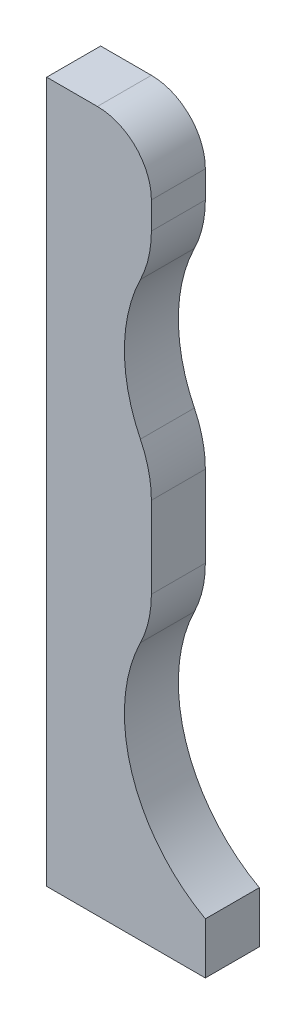
ISO-10303-21;
HEADER;
FILE_DESCRIPTION(('STEP AP214'),'2;1');
FILE_NAME('part.step','',(''),(''),'','','');
FILE_SCHEMA(('AUTOMOTIVE_DESIGN { 1 0 10303 214 1 1 1 1 }'));
ENDSEC;
DATA;
#1=APPLICATION_CONTEXT('core data for automotive mechanical design processes');
#2=APPLICATION_PROTOCOL_DEFINITION('international standard','automotive_design',2000,#1);
#3=PRODUCT_CONTEXT('',#1,'mechanical');
#4=PRODUCT('Part','Part','',(#3));
#5=PRODUCT_RELATED_PRODUCT_CATEGORY('part','',(#4));
#6=PRODUCT_DEFINITION_FORMATION('','',#4);
#7=PRODUCT_DEFINITION_CONTEXT('part definition',#1,'design');
#8=PRODUCT_DEFINITION('design','',#6,#7);
#9=PRODUCT_DEFINITION_SHAPE('','',#8);
#10=(LENGTH_UNIT() NAMED_UNIT(*) SI_UNIT(.MILLI.,.METRE.));
#11=(NAMED_UNIT(*) PLANE_ANGLE_UNIT() SI_UNIT($,.RADIAN.));
#12=(NAMED_UNIT(*) SI_UNIT($,.STERADIAN.) SOLID_ANGLE_UNIT());
#13=UNCERTAINTY_MEASURE_WITH_UNIT(LENGTH_MEASURE(1.E-05),#10,'distance_accuracy_value','');
#14=(GEOMETRIC_REPRESENTATION_CONTEXT(3) GLOBAL_UNCERTAINTY_ASSIGNED_CONTEXT((#13)) GLOBAL_UNIT_ASSIGNED_CONTEXT((#10,
#11,#12)) REPRESENTATION_CONTEXT('',''));
#15=CARTESIAN_POINT('',(0.,0.,0.));
#16=DIRECTION('',(0.,0.,1.));
#17=DIRECTION('',(1.,0.,0.));
#18=AXIS2_PLACEMENT_3D('',#15,#16,#17);
#19=CARTESIAN_POINT('',(3197.45362169219,2665.2958617396,3.175));
#20=DIRECTION('',(0.,0.,-1.));
#21=DIRECTION('',(-1.,0.,0.));
#22=AXIS2_PLACEMENT_3D('',#19,#20,#21);
#23=CYLINDRICAL_SURFACE('',#22,6.35000000000036);
#24=CARTESIAN_POINT('',(3197.45362169219,2665.2958617396,0.));
#25=DIRECTION('',(0.,0.,1.));
#26=DIRECTION('',(1.,0.,0.));
#27=AXIS2_PLACEMENT_3D('',#24,#25,#26);
#28=CIRCLE('',#27,6.35000000000036);
#29=CARTESIAN_POINT('',(3203.1575085461,2662.50513159179,0.));
#30=VERTEX_POINT('',#29);
#31=CARTESIAN_POINT('',(3203.80362169219,2665.29586173967,0.));
#32=VERTEX_POINT('',#31);
#33=EDGE_CURVE('E153',#30,#32,#28,.T.);
#34=ORIENTED_EDGE('',*,*,#33,.T.);
#35=DIRECTION('',(0.,0.,-1.));
#36=VECTOR('',#35,1.);
#37=CARTESIAN_POINT('',(3203.80362169219,2665.29586173967,3.175));
#38=LINE('',#37,#36);
#39=CARTESIAN_POINT('',(3203.80362169219,2665.29586173967,3.175));
#40=VERTEX_POINT('',#39);
#41=EDGE_CURVE('E11',#40,#32,#38,.T.);
#42=ORIENTED_EDGE('',*,*,#41,.F.);
#43=CARTESIAN_POINT('',(3197.45362169219,2665.2958617396,3.175));
#44=DIRECTION('',(0.,0.,1.));
#45=DIRECTION('',(1.,0.,0.));
#46=AXIS2_PLACEMENT_3D('',#43,#44,#45);
#47=CIRCLE('',#46,6.35000000000036);
#48=CARTESIAN_POINT('',(3203.1575085461,2662.50513159179,3.175));
#49=VERTEX_POINT('',#48);
#50=EDGE_CURVE('E175',#49,#40,#47,.T.);
#51=ORIENTED_EDGE('',*,*,#50,.F.);
#52=DIRECTION('',(0.,0.,-1.));
#53=VECTOR('',#52,1.);
#54=CARTESIAN_POINT('',(3203.1575085461,2662.50513159179,3.175));
#55=LINE('',#54,#53);
#56=EDGE_CURVE('E149',#49,#30,#55,.T.);
#57=ORIENTED_EDGE('',*,*,#56,.T.);
#58=EDGE_LOOP('',(#34,#42,#51,#57));
#59=FACE_BOUND('',#58,.T.);
#60=ADVANCED_FACE('F33',(#59),#23,.T.);
#61=CARTESIAN_POINT('',(3203.80362169219,2665.29586173967,3.175));
#62=DIRECTION('',(-1.,0.,0.));
#63=DIRECTION('',(0.,0.,1.));
#64=AXIS2_PLACEMENT_3D('',#61,#62,#63);
#65=PLANE('',#64);
#66=DIRECTION('',(0.,1.,0.));
#67=VECTOR('',#66,1.);
#68=CARTESIAN_POINT('',(3203.80362169219,2665.29586173967,0.));
#69=LINE('',#68,#67);
#70=CARTESIAN_POINT('',(3203.80362169221,2670.08611379305,0.));
#71=VERTEX_POINT('',#70);
#72=EDGE_CURVE('E156',#32,#71,#69,.T.);
#73=ORIENTED_EDGE('',*,*,#72,.T.);
#74=DIRECTION('',(0.,0.,-1.));
#75=VECTOR('',#74,1.);
#76=CARTESIAN_POINT('',(3203.80362169221,2670.08611379305,3.175));
#77=LINE('',#76,#75);
#78=CARTESIAN_POINT('',(3203.80362169221,2670.08611379305,3.175));
#79=VERTEX_POINT('',#78);
#80=EDGE_CURVE('E41',#79,#71,#77,.T.);
#81=ORIENTED_EDGE('',*,*,#80,.F.);
#82=DIRECTION('',(0.,1.,0.));
#83=VECTOR('',#82,1.);
#84=CARTESIAN_POINT('',(3203.80362169219,2665.29586173967,3.175));
#85=LINE('',#84,#83);
#86=EDGE_CURVE('E104',#40,#79,#85,.T.);
#87=ORIENTED_EDGE('',*,*,#86,.F.);
#88=ORIENTED_EDGE('',*,*,#41,.T.);
#89=EDGE_LOOP('',(#73,#81,#87,#88));
#90=FACE_BOUND('',#89,.T.);
#91=ADVANCED_FACE('F253',(#90),#65,.F.);
#92=CARTESIAN_POINT('',(3197.45362169219,2670.08611379305,3.175));
#93=DIRECTION('',(0.,0.,-1.));
#94=DIRECTION('',(-1.,0.,0.));
#95=AXIS2_PLACEMENT_3D('',#92,#93,#94);
#96=CYLINDRICAL_SURFACE('',#95,6.35000000001626);
#97=CARTESIAN_POINT('',(3197.45362169219,2670.08611379305,0.));
#98=DIRECTION('',(0.,0.,1.));
#99=DIRECTION('',(1.,0.,0.));
#100=AXIS2_PLACEMENT_3D('',#97,#98,#99);
#101=CIRCLE('',#100,6.35000000001626);
#102=CARTESIAN_POINT('',(3203.1575085461,2672.87684394092,0.));
#103=VERTEX_POINT('',#102);
#104=EDGE_CURVE('E158',#71,#103,#101,.T.);
#105=ORIENTED_EDGE('',*,*,#104,.T.);
#106=DIRECTION('',(0.,0.,-1.));
#107=VECTOR('',#106,1.);
#108=CARTESIAN_POINT('',(3203.1575085461,2672.87684394092,3.175));
#109=LINE('',#108,#107);
#110=CARTESIAN_POINT('',(3203.1575085461,2672.87684394092,3.175));
#111=VERTEX_POINT('',#110);
#112=EDGE_CURVE('E194',#111,#103,#109,.T.);
#113=ORIENTED_EDGE('',*,*,#112,.F.);
#114=CARTESIAN_POINT('',(3197.45362169219,2670.08611379305,3.175));
#115=DIRECTION('',(0.,0.,1.));
#116=DIRECTION('',(1.,0.,0.));
#117=AXIS2_PLACEMENT_3D('',#114,#115,#116);
#118=CIRCLE('',#117,6.35000000001626);
#119=EDGE_CURVE('E202',#79,#111,#118,.T.);
#120=ORIENTED_EDGE('',*,*,#119,.F.);
#121=ORIENTED_EDGE('',*,*,#80,.T.);
#122=EDGE_LOOP('',(#105,#113,#120,#121));
#123=FACE_BOUND('',#122,.T.);
#124=ADVANCED_FACE('F200',(#123),#96,.T.);
#125=CARTESIAN_POINT('',(3211.46807169219,2676.94293776636,3.175));
#126=DIRECTION('',(0.,0.,-1.));
#127=DIRECTION('',(-1.,0.,0.));
#128=AXIS2_PLACEMENT_3D('',#125,#126,#127);
#129=CYLINDRICAL_SURFACE('',#128,9.25195000000089);
#130=CARTESIAN_POINT('',(3211.46807169219,2676.94293776636,0.));
#131=DIRECTION('',(0.,0.,-1.));
#132=DIRECTION('',(1.,0.,0.));
#133=AXIS2_PLACEMENT_3D('',#130,#131,#132);
#134=CIRCLE('',#133,9.25195000000089);
#135=CARTESIAN_POINT('',(3203.1575085461,2681.0090315918,0.));
#136=VERTEX_POINT('',#135);
#137=EDGE_CURVE('E160',#103,#136,#134,.T.);
#138=ORIENTED_EDGE('',*,*,#137,.T.);
#139=DIRECTION('',(0.,0.,-1.));
#140=VECTOR('',#139,1.);
#141=CARTESIAN_POINT('',(3203.1575085461,2681.0090315918,3.175));
#142=LINE('',#141,#140);
#143=CARTESIAN_POINT('',(3203.1575085461,2681.0090315918,3.175));
#144=VERTEX_POINT('',#143);
#145=EDGE_CURVE('E191',#144,#136,#142,.T.);
#146=ORIENTED_EDGE('',*,*,#145,.F.);
#147=CARTESIAN_POINT('',(3211.46807169219,2676.94293776636,3.175));
#148=DIRECTION('',(0.,0.,-1.));
#149=DIRECTION('',(1.,0.,0.));
#150=AXIS2_PLACEMENT_3D('',#147,#148,#149);
#151=CIRCLE('',#150,9.25195000000089);
#152=EDGE_CURVE('E220',#111,#144,#151,.T.);
#153=ORIENTED_EDGE('',*,*,#152,.F.);
#154=ORIENTED_EDGE('',*,*,#112,.T.);
#155=EDGE_LOOP('',(#138,#146,#153,#154));
#156=FACE_BOUND('',#155,.T.);
#157=ADVANCED_FACE('F211',(#156),#129,.F.);
#158=CARTESIAN_POINT('',(3197.45362169219,2683.7997617396,3.175));
#159=DIRECTION('',(0.,0.,-1.));
#160=DIRECTION('',(-1.,0.,0.));
#161=AXIS2_PLACEMENT_3D('',#158,#159,#160);
#162=CYLINDRICAL_SURFACE('',#161,6.34999999999983);
#163=CARTESIAN_POINT('',(3197.45362169219,2683.7997617396,0.));
#164=DIRECTION('',(0.,0.,1.));
#165=DIRECTION('',(1.,0.,0.));
#166=AXIS2_PLACEMENT_3D('',#163,#164,#165);
#167=CIRCLE('',#166,6.34999999999983);
#168=CARTESIAN_POINT('',(3203.80362169219,2683.79976173967,0.));
#169=VERTEX_POINT('',#168);
#170=EDGE_CURVE('E162',#136,#169,#167,.T.);
#171=ORIENTED_EDGE('',*,*,#170,.T.);
#172=DIRECTION('',(0.,0.,-1.));
#173=VECTOR('',#172,1.);
#174=CARTESIAN_POINT('',(3203.80362169219,2683.79976173967,3.175));
#175=LINE('',#174,#173);
#176=CARTESIAN_POINT('',(3203.80362169219,2683.79976173967,3.175));
#177=VERTEX_POINT('',#176);
#178=EDGE_CURVE('E188',#177,#169,#175,.T.);
#179=ORIENTED_EDGE('',*,*,#178,.F.);
#180=CARTESIAN_POINT('',(3197.45362169219,2683.7997617396,3.175));
#181=DIRECTION('',(0.,0.,1.));
#182=DIRECTION('',(1.,0.,0.));
#183=AXIS2_PLACEMENT_3D('',#180,#181,#182);
#184=CIRCLE('',#183,6.34999999999983);
#185=EDGE_CURVE('E217',#144,#177,#184,.T.);
#186=ORIENTED_EDGE('',*,*,#185,.F.);
#187=ORIENTED_EDGE('',*,*,#145,.T.);
#188=EDGE_LOOP('',(#171,#179,#186,#187));
#189=FACE_BOUND('',#188,.T.);
#190=ADVANCED_FACE('F215',(#189),#162,.T.);
#191=CARTESIAN_POINT('',(3203.80362169219,2683.79976173967,3.175));
#192=DIRECTION('',(-1.,0.,0.));
#193=DIRECTION('',(0.,0.,1.));
#194=AXIS2_PLACEMENT_3D('',#191,#192,#193);
#195=PLANE('',#194);
#196=DIRECTION('',(0.,1.,0.));
#197=VECTOR('',#196,1.);
#198=CARTESIAN_POINT('',(3203.80362169219,2683.79976173967,0.));
#199=LINE('',#198,#197);
#200=CARTESIAN_POINT('',(3203.80362169219,2685.3886512737,0.));
#201=VERTEX_POINT('',#200);
#202=EDGE_CURVE('E164',#169,#201,#199,.T.);
#203=ORIENTED_EDGE('',*,*,#202,.T.);
#204=DIRECTION('',(0.,0.,-1.));
#205=VECTOR('',#204,1.);
#206=CARTESIAN_POINT('',(3203.80362169219,2685.3886512737,3.175));
#207=LINE('',#206,#205);
#208=CARTESIAN_POINT('',(3203.80362169219,2685.3886512737,3.175));
#209=VERTEX_POINT('',#208);
#210=EDGE_CURVE('E185',#209,#201,#207,.T.);
#211=ORIENTED_EDGE('',*,*,#210,.F.);
#212=DIRECTION('',(0.,1.,0.));
#213=VECTOR('',#212,1.);
#214=CARTESIAN_POINT('',(3203.80362169219,2683.79976173967,3.175));
#215=LINE('',#214,#213);
#216=EDGE_CURVE('E219',#177,#209,#215,.T.);
#217=ORIENTED_EDGE('',*,*,#216,.F.);
#218=ORIENTED_EDGE('',*,*,#178,.T.);
#219=EDGE_LOOP('',(#203,#211,#217,#218));
#220=FACE_BOUND('',#219,.T.);
#221=ADVANCED_FACE('F266',(#220),#195,.F.);
#222=CARTESIAN_POINT('',(3200.62862169219,2685.3886512737,3.175));
#223=DIRECTION('',(0.,0.,-1.));
#224=DIRECTION('',(-1.,0.,0.));
#225=AXIS2_PLACEMENT_3D('',#222,#223,#224);
#226=CYLINDRICAL_SURFACE('',#225,3.17499999999993);
#227=CARTESIAN_POINT('',(3200.62862169219,2685.3886512737,0.));
#228=DIRECTION('',(0.,0.,1.));
#229=DIRECTION('',(1.,0.,0.));
#230=AXIS2_PLACEMENT_3D('',#227,#228,#229);
#231=CIRCLE('',#230,3.17499999999993);
#232=CARTESIAN_POINT('',(3200.62862169219,2688.5636512737,0.));
#233=VERTEX_POINT('',#232);
#234=EDGE_CURVE('E166',#201,#233,#231,.T.);
#235=ORIENTED_EDGE('',*,*,#234,.T.);
#236=DIRECTION('',(0.,0.,-1.));
#237=VECTOR('',#236,1.);
#238=CARTESIAN_POINT('',(3200.62862169219,2688.5636512737,3.175));
#239=LINE('',#238,#237);
#240=CARTESIAN_POINT('',(3200.62862169219,2688.5636512737,3.175));
#241=VERTEX_POINT('',#240);
#242=EDGE_CURVE('E182',#241,#233,#239,.T.);
#243=ORIENTED_EDGE('',*,*,#242,.F.);
#244=CARTESIAN_POINT('',(3200.62862169219,2685.3886512737,3.175));
#245=DIRECTION('',(0.,0.,1.));
#246=DIRECTION('',(1.,0.,0.));
#247=AXIS2_PLACEMENT_3D('',#244,#245,#246);
#248=CIRCLE('',#247,3.17499999999993);
#249=EDGE_CURVE('E222',#209,#241,#248,.T.);
#250=ORIENTED_EDGE('',*,*,#249,.F.);
#251=ORIENTED_EDGE('',*,*,#210,.T.);
#252=EDGE_LOOP('',(#235,#243,#250,#251));
#253=FACE_BOUND('',#252,.T.);
#254=ADVANCED_FACE('F269',(#253),#226,.T.);
#255=CARTESIAN_POINT('',(3197.64412169219,2688.5636512737,3.175));
#256=DIRECTION('',(0.,-1.,0.));
#257=DIRECTION('',(0.,0.,-1.));
#258=AXIS2_PLACEMENT_3D('',#255,#256,#257);
#259=PLANE('',#258);
#260=DIRECTION('',(-1.,0.,0.));
#261=VECTOR('',#260,1.);
#262=CARTESIAN_POINT('',(3197.64412169219,2688.5636512737,0.));
#263=LINE('',#262,#261);
#264=CARTESIAN_POINT('',(3197.64412169219,2688.5636512737,0.));
#265=VERTEX_POINT('',#264);
#266=EDGE_CURVE('E168',#233,#265,#263,.T.);
#267=ORIENTED_EDGE('',*,*,#266,.T.);
#268=DIRECTION('',(0.,0.,-1.));
#269=VECTOR('',#268,1.);
#270=CARTESIAN_POINT('',(3197.64412169219,2688.5636512737,3.175));
#271=LINE('',#270,#269);
#272=CARTESIAN_POINT('',(3197.64412169219,2688.5636512737,3.175));
#273=VERTEX_POINT('',#272);
#274=EDGE_CURVE('E179',#273,#265,#271,.T.);
#275=ORIENTED_EDGE('',*,*,#274,.F.);
#276=DIRECTION('',(-1.,0.,0.));
#277=VECTOR('',#276,1.);
#278=CARTESIAN_POINT('',(3197.64412169219,2688.5636512737,3.175));
#279=LINE('',#278,#277);
#280=EDGE_CURVE('E228',#241,#273,#279,.T.);
#281=ORIENTED_EDGE('',*,*,#280,.F.);
#282=ORIENTED_EDGE('',*,*,#242,.T.);
#283=EDGE_LOOP('',(#267,#275,#281,#282));
#284=FACE_BOUND('',#283,.T.);
#285=ADVANCED_FACE('F234',(#284),#259,.F.);
#286=CARTESIAN_POINT('',(3197.64412169219,2688.5636512737,3.175));
#287=DIRECTION('',(1.,0.,0.));
#288=DIRECTION('',(0.,0.,-1.));
#289=AXIS2_PLACEMENT_3D('',#286,#287,#288);
#290=PLANE('',#289);
#291=DIRECTION('',(0.,-1.,0.));
#292=VECTOR('',#291,1.);
#293=CARTESIAN_POINT('',(3197.64412169219,2688.5636512737,0.));
#294=LINE('',#293,#292);
#295=CARTESIAN_POINT('',(3197.64412169219,2647.33539686263,0.));
#296=VERTEX_POINT('',#295);
#297=EDGE_CURVE('E170',#265,#296,#294,.T.);
#298=ORIENTED_EDGE('',*,*,#297,.T.);
#299=DIRECTION('',(0.,0.,-1.));
#300=VECTOR('',#299,1.);
#301=CARTESIAN_POINT('',(3197.64412169219,2647.33539686263,3.175));
#302=LINE('',#301,#300);
#303=CARTESIAN_POINT('',(3197.64412169219,2647.33539686263,3.175));
#304=VERTEX_POINT('',#303);
#305=EDGE_CURVE('E144',#304,#296,#302,.T.);
#306=ORIENTED_EDGE('',*,*,#305,.F.);
#307=DIRECTION('',(0.,-1.,0.));
#308=VECTOR('',#307,1.);
#309=CARTESIAN_POINT('',(3197.64412169219,2688.5636512737,3.175));
#310=LINE('',#309,#308);
#311=EDGE_CURVE('E135',#273,#304,#310,.T.);
#312=ORIENTED_EDGE('',*,*,#311,.F.);
#313=ORIENTED_EDGE('',*,*,#274,.T.);
#314=EDGE_LOOP('',(#298,#306,#312,#313));
#315=FACE_BOUND('',#314,.T.);
#316=ADVANCED_FACE('F238',(#315),#290,.F.);
#317=CARTESIAN_POINT('',(3197.64412169219,2647.33539686263,3.175));
#318=DIRECTION('',(0.,1.,0.));
#319=DIRECTION('',(0.,0.,1.));
#320=AXIS2_PLACEMENT_3D('',#317,#318,#319);
#321=PLANE('',#320);
#322=DIRECTION('',(1.,0.,0.));
#323=VECTOR('',#322,1.);
#324=CARTESIAN_POINT('',(3197.64412169219,2647.33539686263,0.));
#325=LINE('',#324,#323);
#326=CARTESIAN_POINT('',(3206.97862169219,2647.33539686263,0.));
#327=VERTEX_POINT('',#326);
#328=EDGE_CURVE('E143',#296,#327,#325,.T.);
#329=ORIENTED_EDGE('',*,*,#328,.T.);
#330=DIRECTION('',(0.,0.,-1.));
#331=VECTOR('',#330,1.);
#332=CARTESIAN_POINT('',(3206.97862169219,2647.33539686263,3.175));
#333=LINE('',#332,#331);
#334=CARTESIAN_POINT('',(3206.97862169219,2647.33539686263,3.175));
#335=VERTEX_POINT('',#334);
#336=EDGE_CURVE('E140',#335,#327,#333,.T.);
#337=ORIENTED_EDGE('',*,*,#336,.F.);
#338=DIRECTION('',(1.,0.,0.));
#339=VECTOR('',#338,1.);
#340=CARTESIAN_POINT('',(3197.64412169219,2647.33539686263,3.175));
#341=LINE('',#340,#339);
#342=EDGE_CURVE('E129',#304,#335,#341,.T.);
#343=ORIENTED_EDGE('',*,*,#342,.F.);
#344=ORIENTED_EDGE('',*,*,#305,.T.);
#345=EDGE_LOOP('',(#329,#337,#343,#344));
#346=FACE_BOUND('',#345,.T.);
#347=ADVANCED_FACE('F141',(#346),#321,.F.);
#348=CARTESIAN_POINT('',(3206.97862169219,2647.33539686263,3.175));
#349=DIRECTION('',(-1.,-7.95665953423549E-12,0.));
#350=DIRECTION('',(7.95665953423549E-12,-1.,0.));
#351=AXIS2_PLACEMENT_3D('',#348,#349,#350);
#352=PLANE('',#351);
#353=DIRECTION('',(-7.95665953423549E-12,1.,0.));
#354=VECTOR('',#353,1.);
#355=CARTESIAN_POINT('',(3206.97862169219,2647.33539686263,0.));
#356=LINE('',#355,#354);
#357=CARTESIAN_POINT('',(3206.97862169217,2650.34932717204,0.));
#358=VERTEX_POINT('',#357);
#359=EDGE_CURVE('E90',#327,#358,#356,.T.);
#360=ORIENTED_EDGE('',*,*,#359,.T.);
#361=DIRECTION('',(0.,0.,-1.));
#362=VECTOR('',#361,1.);
#363=CARTESIAN_POINT('',(3206.97862169217,2650.34932717204,3.175));
#364=LINE('',#363,#362);
#365=CARTESIAN_POINT('',(3206.97862169217,2650.34932717204,3.175));
#366=VERTEX_POINT('',#365);
#367=EDGE_CURVE('E145',#366,#358,#364,.T.);
#368=ORIENTED_EDGE('',*,*,#367,.F.);
#369=DIRECTION('',(-7.95665953423549E-12,1.,0.));
#370=VECTOR('',#369,1.);
#371=CARTESIAN_POINT('',(3206.97862169219,2647.33539686263,3.175));
#372=LINE('',#371,#370);
#373=EDGE_CURVE('E133',#335,#366,#372,.T.);
#374=ORIENTED_EDGE('',*,*,#373,.F.);
#375=ORIENTED_EDGE('',*,*,#336,.T.);
#376=EDGE_LOOP('',(#360,#368,#374,#375));
#377=FACE_BOUND('',#376,.T.);
#378=ADVANCED_FACE('F147',(#377),#352,.F.);
#379=CARTESIAN_POINT('',(3211.46807169219,2658.43903776636,3.175));
#380=DIRECTION('',(0.,0.,-1.));
#381=DIRECTION('',(-1.,0.,0.));
#382=AXIS2_PLACEMENT_3D('',#379,#380,#381);
#383=CYLINDRICAL_SURFACE('',#382,9.2519500000002);
#384=CARTESIAN_POINT('',(3211.46807169219,2658.43903776636,0.));
#385=DIRECTION('',(0.,0.,-1.));
#386=DIRECTION('',(1.,0.,0.));
#387=AXIS2_PLACEMENT_3D('',#384,#385,#386);
#388=CIRCLE('',#387,9.2519500000002);
#389=EDGE_CURVE('E96',#358,#30,#388,.T.);
#390=ORIENTED_EDGE('',*,*,#389,.T.);
#391=ORIENTED_EDGE('',*,*,#56,.F.);
#392=CARTESIAN_POINT('',(3211.46807169219,2658.43903776636,3.175));
#393=DIRECTION('',(0.,0.,-1.));
#394=DIRECTION('',(1.,0.,0.));
#395=AXIS2_PLACEMENT_3D('',#392,#393,#394);
#396=CIRCLE('',#395,9.2519500000002);
#397=EDGE_CURVE('E49',#366,#49,#396,.T.);
#398=ORIENTED_EDGE('',*,*,#397,.F.);
#399=ORIENTED_EDGE('',*,*,#367,.T.);
#400=EDGE_LOOP('',(#390,#391,#398,#399));
#401=FACE_BOUND('',#400,.T.);
#402=ADVANCED_FACE('F242',(#401),#383,.F.);
#403=CARTESIAN_POINT('',(3197.45362169219,2665.2958617396,3.175));
#404=DIRECTION('',(0.,0.,1.));
#405=DIRECTION('',(1.,0.,0.));
#406=AXIS2_PLACEMENT_3D('',#403,#404,#405);
#407=PLANE('',#406);
#408=ORIENTED_EDGE('',*,*,#50,.T.);
#409=ORIENTED_EDGE('',*,*,#86,.T.);
#410=ORIENTED_EDGE('',*,*,#119,.T.);
#411=ORIENTED_EDGE('',*,*,#152,.T.);
#412=ORIENTED_EDGE('',*,*,#185,.T.);
#413=ORIENTED_EDGE('',*,*,#216,.T.);
#414=ORIENTED_EDGE('',*,*,#249,.T.);
#415=ORIENTED_EDGE('',*,*,#280,.T.);
#416=ORIENTED_EDGE('',*,*,#311,.T.);
#417=ORIENTED_EDGE('',*,*,#342,.T.);
#418=ORIENTED_EDGE('',*,*,#373,.T.);
#419=ORIENTED_EDGE('',*,*,#397,.T.);
#420=EDGE_LOOP('',(#408,#409,#410,#411,#412,#413,#414,#415,#416,#417,#418,#419));
#421=FACE_BOUND('',#420,.T.);
#422=ADVANCED_FACE('F131',(#421),#407,.T.);
#423=CARTESIAN_POINT('',(3197.45362169219,2665.2958617396,0.));
#424=DIRECTION('',(0.,0.,1.));
#425=DIRECTION('',(1.,0.,0.));
#426=AXIS2_PLACEMENT_3D('',#423,#424,#425);
#427=PLANE('',#426);
#428=ORIENTED_EDGE('',*,*,#33,.F.);
#429=ORIENTED_EDGE('',*,*,#389,.F.);
#430=ORIENTED_EDGE('',*,*,#359,.F.);
#431=ORIENTED_EDGE('',*,*,#328,.F.);
#432=ORIENTED_EDGE('',*,*,#297,.F.);
#433=ORIENTED_EDGE('',*,*,#266,.F.);
#434=ORIENTED_EDGE('',*,*,#234,.F.);
#435=ORIENTED_EDGE('',*,*,#202,.F.);
#436=ORIENTED_EDGE('',*,*,#170,.F.);
#437=ORIENTED_EDGE('',*,*,#137,.F.);
#438=ORIENTED_EDGE('',*,*,#104,.F.);
#439=ORIENTED_EDGE('',*,*,#72,.F.);
#440=EDGE_LOOP('',(#428,#429,#430,#431,#432,#433,#434,#435,#436,#437,#438,#439));
#441=FACE_BOUND('',#440,.T.);
#442=ADVANCED_FACE('F206',(#441),#427,.F.);
#443=CLOSED_SHELL('',(#60,#91,#124,#157,#190,#221,#254,#285,#316,#347,#378,#402,#422,#442));
#444=MANIFOLD_SOLID_BREP('B2',#443);
#445=ADVANCED_BREP_SHAPE_REPRESENTATION('',(#18,#444),#14);
#446=SHAPE_DEFINITION_REPRESENTATION(#9,#445);
ENDSEC;
END-ISO-10303-21;
